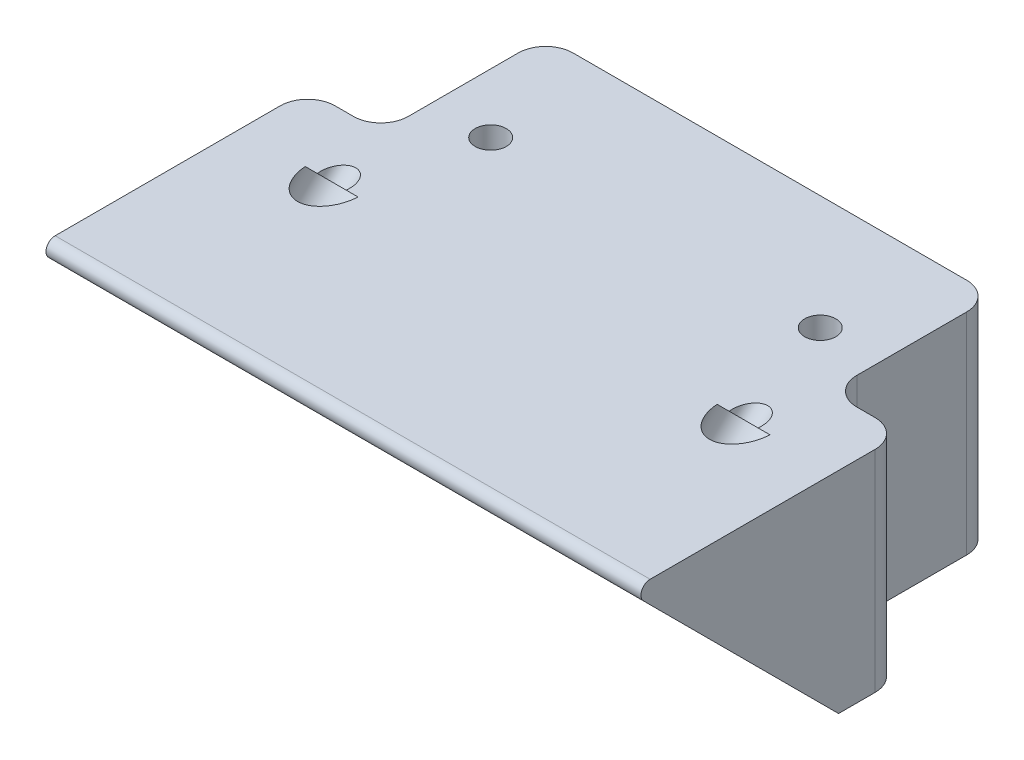
ISO-10303-21;
HEADER;
FILE_DESCRIPTION(('STEP AP214'),'2;1');
FILE_NAME('part.step','',(''),(''),'','','');
FILE_SCHEMA(('AUTOMOTIVE_DESIGN { 1 0 10303 214 1 1 1 1 }'));
ENDSEC;
DATA;
#1=APPLICATION_CONTEXT('core data for automotive mechanical design processes');
#2=APPLICATION_PROTOCOL_DEFINITION('international standard','automotive_design',2000,#1);
#3=PRODUCT_CONTEXT('',#1,'mechanical');
#4=PRODUCT('Part','Part','',(#3));
#5=PRODUCT_RELATED_PRODUCT_CATEGORY('part','',(#4));
#6=PRODUCT_DEFINITION_FORMATION('','',#4);
#7=PRODUCT_DEFINITION_CONTEXT('part definition',#1,'design');
#8=PRODUCT_DEFINITION('design','',#6,#7);
#9=PRODUCT_DEFINITION_SHAPE('','',#8);
#10=(LENGTH_UNIT() NAMED_UNIT(*) SI_UNIT(.MILLI.,.METRE.));
#11=(NAMED_UNIT(*) PLANE_ANGLE_UNIT() SI_UNIT($,.RADIAN.));
#12=(NAMED_UNIT(*) SI_UNIT($,.STERADIAN.) SOLID_ANGLE_UNIT());
#13=UNCERTAINTY_MEASURE_WITH_UNIT(LENGTH_MEASURE(1.E-05),#10,'distance_accuracy_value','');
#14=(GEOMETRIC_REPRESENTATION_CONTEXT(3) GLOBAL_UNCERTAINTY_ASSIGNED_CONTEXT((#13)) GLOBAL_UNIT_ASSIGNED_CONTEXT((#10,
#11,#12)) REPRESENTATION_CONTEXT('',''));
#15=CARTESIAN_POINT('',(0.,0.,0.));
#16=DIRECTION('',(0.,0.,1.));
#17=DIRECTION('',(1.,0.,0.));
#18=AXIS2_PLACEMENT_3D('',#15,#16,#17);
#19=CARTESIAN_POINT('',(0.,23.,0.));
#20=DIRECTION('',(0.,-1.,0.));
#21=DIRECTION('',(0.,0.,-1.));
#22=AXIS2_PLACEMENT_3D('',#19,#20,#21);
#23=PLANE('',#22);
#24=CARTESIAN_POINT('',(-18.,23.,0.));
#25=DIRECTION('',(0.,-1.,0.));
#26=DIRECTION('',(0.,0.,-1.));
#27=AXIS2_PLACEMENT_3D('',#24,#25,#26);
#28=CIRCLE('',#27,1.7);
#29=CARTESIAN_POINT('',(-18.,23.,-1.7));
#30=VERTEX_POINT('',#29);
#31=EDGE_CURVE('E345',#30,#30,#28,.T.);
#32=ORIENTED_EDGE('',*,*,#31,.T.);
#33=EDGE_LOOP('',(#32));
#34=FACE_BOUND('',#33,.T.);
#35=CARTESIAN_POINT('',(18.,23.,0.));
#36=DIRECTION('',(0.,-1.,0.));
#37=DIRECTION('',(0.,0.,1.));
#38=AXIS2_PLACEMENT_3D('',#35,#36,#37);
#39=CIRCLE('',#38,1.7);
#40=CARTESIAN_POINT('',(18.,23.,1.7));
#41=VERTEX_POINT('',#40);
#42=EDGE_CURVE('E506',#41,#41,#39,.T.);
#43=ORIENTED_EDGE('',*,*,#42,.T.);
#44=EDGE_LOOP('',(#43));
#45=FACE_BOUND('',#44,.T.);
#46=DIRECTION('',(1.,0.,0.));
#47=VECTOR('',#46,1.);
#48=CARTESIAN_POINT('',(-32.5,23.,5.5));
#49=LINE('',#48,#47);
#50=CARTESIAN_POINT('',(-29.5,23.,5.5));
#51=VERTEX_POINT('',#50);
#52=CARTESIAN_POINT('',(-27.5,23.,5.5));
#53=VERTEX_POINT('',#52);
#54=EDGE_CURVE('E464',#51,#53,#49,.T.);
#55=ORIENTED_EDGE('',*,*,#54,.F.);
#56=CARTESIAN_POINT('',(-29.5,23.,8.5));
#57=DIRECTION('',(0.,-1.,0.));
#58=DIRECTION('',(0.,0.,-1.));
#59=AXIS2_PLACEMENT_3D('',#56,#57,#58);
#60=CIRCLE('',#59,3.);
#61=CARTESIAN_POINT('',(-32.5,23.,8.5));
#62=VERTEX_POINT('',#61);
#63=EDGE_CURVE('E393',#51,#62,#60,.F.);
#64=ORIENTED_EDGE('',*,*,#63,.T.);
#65=DIRECTION('',(0.,0.,1.));
#66=VECTOR('',#65,1.);
#67=CARTESIAN_POINT('',(-32.5,23.,12.5));
#68=LINE('',#67,#66);
#69=CARTESIAN_POINT('',(-32.5,23.,33.085786437627));
#70=VERTEX_POINT('',#69);
#71=EDGE_CURVE('E306',#62,#70,#68,.T.);
#72=ORIENTED_EDGE('',*,*,#71,.T.);
#73=DIRECTION('',(1.,0.,0.));
#74=VECTOR('',#73,1.);
#75=CARTESIAN_POINT('',(32.5,23.,33.085786437627));
#76=LINE('',#75,#74);
#77=CARTESIAN_POINT('',(32.5,23.,33.085786437627));
#78=VERTEX_POINT('',#77);
#79=EDGE_CURVE('E209',#70,#78,#76,.T.);
#80=ORIENTED_EDGE('',*,*,#79,.T.);
#81=DIRECTION('',(0.,0.,-1.));
#82=VECTOR('',#81,1.);
#83=CARTESIAN_POINT('',(32.5,23.,12.5));
#84=LINE('',#83,#82);
#85=CARTESIAN_POINT('',(32.5,23.,8.49999999999999));
#86=VERTEX_POINT('',#85);
#87=EDGE_CURVE('E297',#78,#86,#84,.T.);
#88=ORIENTED_EDGE('',*,*,#87,.T.);
#89=CARTESIAN_POINT('',(29.5,23.,8.49999999999999));
#90=DIRECTION('',(0.,-1.,0.));
#91=DIRECTION('',(0.,0.,-1.));
#92=AXIS2_PLACEMENT_3D('',#89,#90,#91);
#93=CIRCLE('',#92,3.);
#94=CARTESIAN_POINT('',(29.5,23.,5.49999999999999));
#95=VERTEX_POINT('',#94);
#96=EDGE_CURVE('E387',#86,#95,#93,.F.);
#97=ORIENTED_EDGE('',*,*,#96,.T.);
#98=DIRECTION('',(1.,0.,0.));
#99=VECTOR('',#98,1.);
#100=CARTESIAN_POINT('',(32.5,23.,5.49999999999999));
#101=LINE('',#100,#99);
#102=CARTESIAN_POINT('',(27.5,23.,5.49999999999999));
#103=VERTEX_POINT('',#102);
#104=EDGE_CURVE('E456',#103,#95,#101,.T.);
#105=ORIENTED_EDGE('',*,*,#104,.F.);
#106=CARTESIAN_POINT('',(27.5,23.,2.49999999999999));
#107=DIRECTION('',(0.,-1.,0.));
#108=DIRECTION('',(0.,0.,-1.));
#109=AXIS2_PLACEMENT_3D('',#106,#107,#108);
#110=CIRCLE('',#109,3.);
#111=CARTESIAN_POINT('',(24.5,23.,2.49999999999999));
#112=VERTEX_POINT('',#111);
#113=EDGE_CURVE('E54',#103,#112,#110,.T.);
#114=ORIENTED_EDGE('',*,*,#113,.T.);
#115=DIRECTION('',(0.,0.,1.));
#116=VECTOR('',#115,1.);
#117=CARTESIAN_POINT('',(24.5,23.,-12.5));
#118=LINE('',#117,#116);
#119=CARTESIAN_POINT('',(24.5,23.,-9.5));
#120=VERTEX_POINT('',#119);
#121=EDGE_CURVE('E454',#120,#112,#118,.T.);
#122=ORIENTED_EDGE('',*,*,#121,.F.);
#123=CARTESIAN_POINT('',(21.5,23.,-9.5));
#124=DIRECTION('',(0.,-1.,0.));
#125=DIRECTION('',(0.,0.,-1.));
#126=AXIS2_PLACEMENT_3D('',#123,#124,#125);
#127=CIRCLE('',#126,3.);
#128=CARTESIAN_POINT('',(21.5,23.,-12.5));
#129=VERTEX_POINT('',#128);
#130=EDGE_CURVE('E384',#120,#129,#127,.F.);
#131=ORIENTED_EDGE('',*,*,#130,.T.);
#132=DIRECTION('',(-1.,0.,0.));
#133=VECTOR('',#132,1.);
#134=CARTESIAN_POINT('',(-32.5,23.,-12.5));
#135=LINE('',#134,#133);
#136=CARTESIAN_POINT('',(-21.5,23.,-12.5));
#137=VERTEX_POINT('',#136);
#138=EDGE_CURVE('E301',#129,#137,#135,.T.);
#139=ORIENTED_EDGE('',*,*,#138,.T.);
#140=CARTESIAN_POINT('',(-21.5,23.,-9.5));
#141=DIRECTION('',(0.,-1.,0.));
#142=DIRECTION('',(0.,0.,-1.));
#143=AXIS2_PLACEMENT_3D('',#140,#141,#142);
#144=CIRCLE('',#143,3.);
#145=CARTESIAN_POINT('',(-24.5,23.,-9.5));
#146=VERTEX_POINT('',#145);
#147=EDGE_CURVE('E390',#137,#146,#144,.F.);
#148=ORIENTED_EDGE('',*,*,#147,.T.);
#149=DIRECTION('',(0.,0.,-1.));
#150=VECTOR('',#149,1.);
#151=CARTESIAN_POINT('',(-24.5,23.,-12.5));
#152=LINE('',#151,#150);
#153=CARTESIAN_POINT('',(-24.5,23.,2.5));
#154=VERTEX_POINT('',#153);
#155=EDGE_CURVE('E502',#154,#146,#152,.T.);
#156=ORIENTED_EDGE('',*,*,#155,.F.);
#157=CARTESIAN_POINT('',(-27.5,23.,2.5));
#158=DIRECTION('',(0.,-1.,0.));
#159=DIRECTION('',(0.,0.,-1.));
#160=AXIS2_PLACEMENT_3D('',#157,#158,#159);
#161=CIRCLE('',#160,3.);
#162=EDGE_CURVE('E442',#154,#53,#161,.T.);
#163=ORIENTED_EDGE('',*,*,#162,.T.);
#164=EDGE_LOOP('',(#55,#64,#72,#80,#88,#97,#105,#114,#122,#131,#139,#148,#156,#163));
#165=FACE_BOUND('',#164,.T.);
#166=CARTESIAN_POINT('',(22.5,23.,12.5000000000001));
#167=DIRECTION('',(0.,-1.,0.));
#168=DIRECTION('',(0.,0.,1.));
#169=AXIS2_PLACEMENT_3D('',#166,#167,#168);
#170=ELLIPSE('',#169,4.10121933088197,2.9);
#171=CARTESIAN_POINT('',(25.3880081290223,23.,12.8725830020305));
#172=VERTEX_POINT('',#171);
#173=CARTESIAN_POINT('',(19.6119918709777,23.,12.8725830020305));
#174=VERTEX_POINT('',#173);
#175=EDGE_CURVE('E210',#172,#174,#170,.T.);
#176=ORIENTED_EDGE('',*,*,#175,.T.);
#177=DIRECTION('',(1.,0.,0.));
#178=VECTOR('',#177,1.);
#179=CARTESIAN_POINT('',(0.,23.,12.8725830020305));
#180=LINE('',#179,#178);
#181=CARTESIAN_POINT('',(20.9218393765846,23.,12.8725830020305));
#182=VERTEX_POINT('',#181);
#183=EDGE_CURVE('E239',#174,#182,#180,.T.);
#184=ORIENTED_EDGE('',*,*,#183,.T.);
#185=CARTESIAN_POINT('',(22.5,23.,12.5000000000001));
#186=DIRECTION('',(0.,-1.,0.));
#187=DIRECTION('',(0.,0.,1.));
#188=AXIS2_PLACEMENT_3D('',#185,#186,#187);
#189=ELLIPSE('',#188,2.26274169979695,1.6);
#190=CARTESIAN_POINT('',(24.0781606234154,23.,12.8725830020305));
#191=VERTEX_POINT('',#190);
#192=EDGE_CURVE('E240',#182,#191,#189,.T.);
#193=ORIENTED_EDGE('',*,*,#192,.T.);
#194=EDGE_CURVE('E230',#191,#172,#180,.T.);
#195=ORIENTED_EDGE('',*,*,#194,.T.);
#196=EDGE_LOOP('',(#176,#184,#193,#195));
#197=FACE_BOUND('',#196,.T.);
#198=DIRECTION('',(-1.,0.,0.));
#199=VECTOR('',#198,1.);
#200=CARTESIAN_POINT('',(0.,23.,12.8725830020305));
#201=LINE('',#200,#199);
#202=CARTESIAN_POINT('',(-19.6119918709777,23.,12.8725830020305));
#203=VERTEX_POINT('',#202);
#204=CARTESIAN_POINT('',(-20.9218393765846,23.,12.8725830020305));
#205=VERTEX_POINT('',#204);
#206=EDGE_CURVE('E214',#203,#205,#201,.T.);
#207=ORIENTED_EDGE('',*,*,#206,.F.);
#208=CARTESIAN_POINT('',(-22.5,23.,12.5000000000001));
#209=DIRECTION('',(0.,-1.,0.));
#210=DIRECTION('',(0.,0.,1.));
#211=AXIS2_PLACEMENT_3D('',#208,#209,#210);
#212=ELLIPSE('',#211,4.10121933088197,2.9);
#213=CARTESIAN_POINT('',(-25.3880081290223,23.,12.8725830020305));
#214=VERTEX_POINT('',#213);
#215=EDGE_CURVE('E201',#203,#214,#212,.T.);
#216=ORIENTED_EDGE('',*,*,#215,.T.);
#217=CARTESIAN_POINT('',(-24.0781606234154,23.,12.8725830020305));
#218=VERTEX_POINT('',#217);
#219=EDGE_CURVE('E216',#218,#214,#201,.T.);
#220=ORIENTED_EDGE('',*,*,#219,.F.);
#221=CARTESIAN_POINT('',(-22.5,23.,12.5000000000001));
#222=DIRECTION('',(0.,-1.,0.));
#223=DIRECTION('',(0.,0.,1.));
#224=AXIS2_PLACEMENT_3D('',#221,#222,#223);
#225=ELLIPSE('',#224,2.26274169979695,1.6);
#226=EDGE_CURVE('E223',#218,#205,#225,.T.);
#227=ORIENTED_EDGE('',*,*,#226,.T.);
#228=EDGE_LOOP('',(#207,#216,#220,#227));
#229=FACE_BOUND('',#228,.T.);
#230=ADVANCED_FACE('F45',(#34,#45,#165,#197,#229),#23,.F.);
#231=CARTESIAN_POINT('',(22.5,35.5,0.));
#232=DIRECTION('',(0.,-0.707106781186549,0.707106781186546));
#233=DIRECTION('',(0.,-0.707106781186546,-0.707106781186549));
#234=AXIS2_PLACEMENT_3D('',#231,#232,#233);
#235=CYLINDRICAL_SURFACE('',#234,1.6);
#236=CARTESIAN_POINT('',(22.5,11.5,24.));
#237=DIRECTION('',(0.,-0.707106781186549,0.707106781186546));
#238=DIRECTION('',(0.,-0.707106781186546,-0.707106781186549));
#239=AXIS2_PLACEMENT_3D('',#236,#237,#238);
#240=CIRCLE('',#239,1.6);
#241=CARTESIAN_POINT('',(22.5,10.3686291501015,22.8686291501016));
#242=VERTEX_POINT('',#241);
#243=EDGE_CURVE('E245',#242,#242,#240,.T.);
#244=ORIENTED_EDGE('',*,*,#243,.T.);
#245=EDGE_LOOP('',(#244));
#246=FACE_BOUND('',#245,.T.);
#247=CARTESIAN_POINT('',(22.5,16.4497474683058,19.0502525316942));
#248=DIRECTION('',(0.,0.707106781186549,-0.707106781186546));
#249=DIRECTION('',(0.,0.707106781186546,0.707106781186549));
#250=AXIS2_PLACEMENT_3D('',#247,#248,#249);
#251=CIRCLE('',#250,1.6);
#252=CARTESIAN_POINT('',(22.5,17.5811183182043,20.1816233815927));
#253=VERTEX_POINT('',#252);
#254=EDGE_CURVE('E225',#253,#253,#251,.F.);
#255=ORIENTED_EDGE('',*,*,#254,.F.);
#256=EDGE_LOOP('',(#255));
#257=FACE_BOUND('',#256,.T.);
#258=ADVANCED_FACE('F538',(#246,#257),#235,.F.);
#259=CARTESIAN_POINT('',(-22.5,35.5,0.));
#260=DIRECTION('',(0.,-0.707106781186549,0.707106781186546));
#261=DIRECTION('',(0.,-0.707106781186546,-0.707106781186549));
#262=AXIS2_PLACEMENT_3D('',#259,#260,#261);
#263=CYLINDRICAL_SURFACE('',#262,1.6);
#264=CARTESIAN_POINT('',(-22.5,22.8137084989848,12.6862915010153));
#265=DIRECTION('',(0.,-0.707106781186549,0.707106781186546));
#266=DIRECTION('',(0.,-0.707106781186546,-0.707106781186549));
#267=AXIS2_PLACEMENT_3D('',#264,#265,#266);
#268=CIRCLE('',#267,1.6);
#269=EDGE_CURVE('E309',#205,#218,#268,.F.);
#270=ORIENTED_EDGE('',*,*,#269,.F.);
#271=ORIENTED_EDGE('',*,*,#226,.F.);
#272=EDGE_LOOP('',(#270,#271));
#273=FACE_BOUND('',#272,.T.);
#274=ADVANCED_FACE('F545',(#273),#263,.F.);
#275=CARTESIAN_POINT('',(32.5,23.,12.5));
#276=DIRECTION('',(-1.,0.,0.));
#277=DIRECTION('',(0.,0.,1.));
#278=AXIS2_PLACEMENT_3D('',#275,#276,#277);
#279=PLANE('',#278);
#280=DIRECTION('',(0.,0.,-1.));
#281=VECTOR('',#280,1.);
#282=CARTESIAN_POINT('',(32.5,0.,12.5));
#283=LINE('',#282,#281);
#284=CARTESIAN_POINT('',(32.5,0.,12.5));
#285=VERTEX_POINT('',#284);
#286=CARTESIAN_POINT('',(32.5,0.,8.49999999999999));
#287=VERTEX_POINT('',#286);
#288=EDGE_CURVE('E294',#285,#287,#283,.T.);
#289=ORIENTED_EDGE('',*,*,#288,.T.);
#290=DIRECTION('',(0.,1.,0.));
#291=VECTOR('',#290,1.);
#292=CARTESIAN_POINT('',(32.5,23.,8.49999999999999));
#293=LINE('',#292,#291);
#294=EDGE_CURVE('E424',#287,#86,#293,.T.);
#295=ORIENTED_EDGE('',*,*,#294,.T.);
#296=ORIENTED_EDGE('',*,*,#87,.F.);
#297=CARTESIAN_POINT('',(32.5,22.,33.085786437627));
#298=DIRECTION('',(-1.,0.,0.));
#299=DIRECTION('',(0.,0.,1.));
#300=AXIS2_PLACEMENT_3D('',#297,#298,#299);
#301=CIRCLE('',#300,1.);
#302=CARTESIAN_POINT('',(32.5,21.2928932188134,33.7928932188135));
#303=VERTEX_POINT('',#302);
#304=EDGE_CURVE('E352',#78,#303,#301,.F.);
#305=ORIENTED_EDGE('',*,*,#304,.T.);
#306=DIRECTION('',(0.,-0.707106781186546,-0.707106781186549));
#307=VECTOR('',#306,1.);
#308=CARTESIAN_POINT('',(32.5,0.,12.5));
#309=LINE('',#308,#307);
#310=EDGE_CURVE('E279',#303,#285,#309,.T.);
#311=ORIENTED_EDGE('',*,*,#310,.T.);
#312=EDGE_LOOP('',(#289,#295,#296,#305,#311));
#313=FACE_BOUND('',#312,.T.);
#314=ADVANCED_FACE('F477',(#313),#279,.F.);
#315=CARTESIAN_POINT('',(-32.5,23.,-12.5));
#316=DIRECTION('',(0.,0.,1.));
#317=DIRECTION('',(1.,0.,0.));
#318=AXIS2_PLACEMENT_3D('',#315,#316,#317);
#319=PLANE('',#318);
#320=DIRECTION('',(-1.,0.,0.));
#321=VECTOR('',#320,1.);
#322=CARTESIAN_POINT('',(-32.5,0.,-12.5));
#323=LINE('',#322,#321);
#324=CARTESIAN_POINT('',(-12.5,0.,-12.5));
#325=VERTEX_POINT('',#324);
#326=CARTESIAN_POINT('',(-21.5,0.,-12.5));
#327=VERTEX_POINT('',#326);
#328=EDGE_CURVE('E312',#325,#327,#323,.T.);
#329=ORIENTED_EDGE('',*,*,#328,.T.);
#330=DIRECTION('',(0.,1.,0.));
#331=VECTOR('',#330,1.);
#332=CARTESIAN_POINT('',(-21.5,23.,-12.5));
#333=LINE('',#332,#331);
#334=EDGE_CURVE('E413',#327,#137,#333,.T.);
#335=ORIENTED_EDGE('',*,*,#334,.T.);
#336=ORIENTED_EDGE('',*,*,#138,.F.);
#337=DIRECTION('',(0.,1.,0.));
#338=VECTOR('',#337,1.);
#339=CARTESIAN_POINT('',(21.5,23.,-12.5));
#340=LINE('',#339,#338);
#341=CARTESIAN_POINT('',(21.5,0.,-12.5));
#342=VERTEX_POINT('',#341);
#343=EDGE_CURVE('E410',#129,#342,#340,.F.);
#344=ORIENTED_EDGE('',*,*,#343,.T.);
#345=CARTESIAN_POINT('',(12.5,0.,-12.5));
#346=VERTEX_POINT('',#345);
#347=EDGE_CURVE('E313',#342,#346,#323,.T.);
#348=ORIENTED_EDGE('',*,*,#347,.T.);
#349=DIRECTION('',(0.,-1.,0.));
#350=VECTOR('',#349,1.);
#351=CARTESIAN_POINT('',(12.5,18.,-12.5));
#352=LINE('',#351,#350);
#353=CARTESIAN_POINT('',(12.5,18.,-12.5));
#354=VERTEX_POINT('',#353);
#355=EDGE_CURVE('E283',#354,#346,#352,.T.);
#356=ORIENTED_EDGE('',*,*,#355,.F.);
#357=DIRECTION('',(1.,0.,0.));
#358=VECTOR('',#357,1.);
#359=CARTESIAN_POINT('',(-12.5,18.,-12.5));
#360=LINE('',#359,#358);
#361=CARTESIAN_POINT('',(-12.5,18.,-12.5));
#362=VERTEX_POINT('',#361);
#363=EDGE_CURVE('E253',#362,#354,#360,.T.);
#364=ORIENTED_EDGE('',*,*,#363,.F.);
#365=DIRECTION('',(0.,-1.,0.));
#366=VECTOR('',#365,1.);
#367=CARTESIAN_POINT('',(-12.5,18.,-12.5));
#368=LINE('',#367,#366);
#369=EDGE_CURVE('E266',#362,#325,#368,.T.);
#370=ORIENTED_EDGE('',*,*,#369,.T.);
#371=EDGE_LOOP('',(#329,#335,#336,#344,#348,#356,#364,#370));
#372=FACE_BOUND('',#371,.T.);
#373=ADVANCED_FACE('F568',(#372),#319,.F.);
#374=CARTESIAN_POINT('',(-32.5,23.,12.5));
#375=DIRECTION('',(1.,0.,0.));
#376=DIRECTION('',(0.,0.,-1.));
#377=AXIS2_PLACEMENT_3D('',#374,#375,#376);
#378=PLANE('',#377);
#379=ORIENTED_EDGE('',*,*,#71,.F.);
#380=DIRECTION('',(0.,1.,0.));
#381=VECTOR('',#380,1.);
#382=CARTESIAN_POINT('',(-32.5,23.,8.5));
#383=LINE('',#382,#381);
#384=CARTESIAN_POINT('',(-32.5,0.,8.5));
#385=VERTEX_POINT('',#384);
#386=EDGE_CURVE('E396',#62,#385,#383,.F.);
#387=ORIENTED_EDGE('',*,*,#386,.T.);
#388=DIRECTION('',(0.,0.,1.));
#389=VECTOR('',#388,1.);
#390=CARTESIAN_POINT('',(-32.5,0.,12.5));
#391=LINE('',#390,#389);
#392=CARTESIAN_POINT('',(-32.5,0.,12.5));
#393=VERTEX_POINT('',#392);
#394=EDGE_CURVE('E316',#385,#393,#391,.T.);
#395=ORIENTED_EDGE('',*,*,#394,.T.);
#396=DIRECTION('',(0.,0.707106781186546,0.707106781186549));
#397=VECTOR('',#396,1.);
#398=CARTESIAN_POINT('',(-32.5,0.,12.5));
#399=LINE('',#398,#397);
#400=CARTESIAN_POINT('',(-32.5,21.2928932188134,33.7928932188135));
#401=VERTEX_POINT('',#400);
#402=EDGE_CURVE('E290',#393,#401,#399,.T.);
#403=ORIENTED_EDGE('',*,*,#402,.T.);
#404=CARTESIAN_POINT('',(-32.5,22.,33.085786437627));
#405=DIRECTION('',(1.,0.,0.));
#406=DIRECTION('',(0.,0.,-1.));
#407=AXIS2_PLACEMENT_3D('',#404,#405,#406);
#408=CIRCLE('',#407,1.);
#409=EDGE_CURVE('E358',#401,#70,#408,.F.);
#410=ORIENTED_EDGE('',*,*,#409,.T.);
#411=EDGE_LOOP('',(#379,#387,#395,#403,#410));
#412=FACE_BOUND('',#411,.T.);
#413=ADVANCED_FACE('F565',(#412),#378,.F.);
#414=CARTESIAN_POINT('',(0.,0.,0.));
#415=DIRECTION('',(0.,-1.,0.));
#416=DIRECTION('',(0.,0.,-1.));
#417=AXIS2_PLACEMENT_3D('',#414,#415,#416);
#418=PLANE('',#417);
#419=ORIENTED_EDGE('',*,*,#394,.F.);
#420=CARTESIAN_POINT('',(-29.5,0.,8.5));
#421=DIRECTION('',(0.,-1.,0.));
#422=DIRECTION('',(0.,0.,-1.));
#423=AXIS2_PLACEMENT_3D('',#420,#421,#422);
#424=CIRCLE('',#423,3.);
#425=CARTESIAN_POINT('',(-29.5,0.,5.5));
#426=VERTEX_POINT('',#425);
#427=EDGE_CURVE('E407',#385,#426,#424,.T.);
#428=ORIENTED_EDGE('',*,*,#427,.T.);
#429=DIRECTION('',(-1.,0.,0.));
#430=VECTOR('',#429,1.);
#431=CARTESIAN_POINT('',(0.,0.,5.5));
#432=LINE('',#431,#430);
#433=CARTESIAN_POINT('',(-27.5,0.,5.5));
#434=VERTEX_POINT('',#433);
#435=EDGE_CURVE('E369',#434,#426,#432,.T.);
#436=ORIENTED_EDGE('',*,*,#435,.F.);
#437=CARTESIAN_POINT('',(-27.5,0.,2.5));
#438=DIRECTION('',(0.,-1.,0.));
#439=DIRECTION('',(0.,0.,-1.));
#440=AXIS2_PLACEMENT_3D('',#437,#438,#439);
#441=CIRCLE('',#440,3.);
#442=CARTESIAN_POINT('',(-24.5,0.,2.5));
#443=VERTEX_POINT('',#442);
#444=EDGE_CURVE('E445',#434,#443,#441,.F.);
#445=ORIENTED_EDGE('',*,*,#444,.T.);
#446=DIRECTION('',(0.,0.,1.));
#447=VECTOR('',#446,1.);
#448=CARTESIAN_POINT('',(-24.5,0.,0.));
#449=LINE('',#448,#447);
#450=CARTESIAN_POINT('',(-24.5,0.,-9.5));
#451=VERTEX_POINT('',#450);
#452=EDGE_CURVE('E373',#451,#443,#449,.T.);
#453=ORIENTED_EDGE('',*,*,#452,.F.);
#454=CARTESIAN_POINT('',(-21.5,0.,-9.5));
#455=DIRECTION('',(0.,-1.,0.));
#456=DIRECTION('',(0.,0.,-1.));
#457=AXIS2_PLACEMENT_3D('',#454,#455,#456);
#458=CIRCLE('',#457,3.);
#459=EDGE_CURVE('E404',#451,#327,#458,.T.);
#460=ORIENTED_EDGE('',*,*,#459,.T.);
#461=ORIENTED_EDGE('',*,*,#328,.F.);
#462=DIRECTION('',(0.,0.,-1.));
#463=VECTOR('',#462,1.);
#464=CARTESIAN_POINT('',(-12.5,0.,-12.5));
#465=LINE('',#464,#463);
#466=CARTESIAN_POINT('',(-12.5,0.,7.5));
#467=VERTEX_POINT('',#466);
#468=EDGE_CURVE('E248',#467,#325,#465,.T.);
#469=ORIENTED_EDGE('',*,*,#468,.F.);
#470=DIRECTION('',(-1.,0.,0.));
#471=VECTOR('',#470,1.);
#472=CARTESIAN_POINT('',(-12.5,0.,7.5));
#473=LINE('',#472,#471);
#474=CARTESIAN_POINT('',(12.5,0.,7.5));
#475=VERTEX_POINT('',#474);
#476=EDGE_CURVE('E254',#475,#467,#473,.T.);
#477=ORIENTED_EDGE('',*,*,#476,.F.);
#478=DIRECTION('',(0.,0.,1.));
#479=VECTOR('',#478,1.);
#480=CARTESIAN_POINT('',(12.5,0.,-12.5));
#481=LINE('',#480,#479);
#482=EDGE_CURVE('E269',#346,#475,#481,.T.);
#483=ORIENTED_EDGE('',*,*,#482,.F.);
#484=ORIENTED_EDGE('',*,*,#347,.F.);
#485=CARTESIAN_POINT('',(21.5,0.,-9.5));
#486=DIRECTION('',(0.,-1.,0.));
#487=DIRECTION('',(0.,0.,-1.));
#488=AXIS2_PLACEMENT_3D('',#485,#486,#487);
#489=CIRCLE('',#488,3.);
#490=CARTESIAN_POINT('',(24.5,0.,-9.5));
#491=VERTEX_POINT('',#490);
#492=EDGE_CURVE('E399',#342,#491,#489,.T.);
#493=ORIENTED_EDGE('',*,*,#492,.T.);
#494=DIRECTION('',(0.,0.,-1.));
#495=VECTOR('',#494,1.);
#496=CARTESIAN_POINT('',(24.5,0.,0.));
#497=LINE('',#496,#495);
#498=CARTESIAN_POINT('',(24.5,0.,2.49999999999999));
#499=VERTEX_POINT('',#498);
#500=EDGE_CURVE('E362',#499,#491,#497,.T.);
#501=ORIENTED_EDGE('',*,*,#500,.F.);
#502=CARTESIAN_POINT('',(27.5,0.,2.49999999999999));
#503=DIRECTION('',(0.,-1.,0.));
#504=DIRECTION('',(0.,0.,-1.));
#505=AXIS2_PLACEMENT_3D('',#502,#503,#504);
#506=CIRCLE('',#505,3.);
#507=CARTESIAN_POINT('',(27.5,0.,5.49999999999999));
#508=VERTEX_POINT('',#507);
#509=EDGE_CURVE('E11',#499,#508,#506,.F.);
#510=ORIENTED_EDGE('',*,*,#509,.T.);
#511=DIRECTION('',(-1.,0.,0.));
#512=VECTOR('',#511,1.);
#513=CARTESIAN_POINT('',(0.,0.,5.5));
#514=LINE('',#513,#512);
#515=CARTESIAN_POINT('',(29.5,0.,5.49999999999999));
#516=VERTEX_POINT('',#515);
#517=EDGE_CURVE('E366',#516,#508,#514,.T.);
#518=ORIENTED_EDGE('',*,*,#517,.F.);
#519=CARTESIAN_POINT('',(29.5,0.,8.49999999999999));
#520=DIRECTION('',(0.,-1.,0.));
#521=DIRECTION('',(0.,0.,-1.));
#522=AXIS2_PLACEMENT_3D('',#519,#520,#521);
#523=CIRCLE('',#522,3.);
#524=EDGE_CURVE('E61',#516,#287,#523,.T.);
#525=ORIENTED_EDGE('',*,*,#524,.T.);
#526=ORIENTED_EDGE('',*,*,#288,.F.);
#527=DIRECTION('',(1.,0.,0.));
#528=VECTOR('',#527,1.);
#529=CARTESIAN_POINT('',(-32.5,0.,12.5));
#530=LINE('',#529,#528);
#531=EDGE_CURVE('E302',#393,#285,#530,.T.);
#532=ORIENTED_EDGE('',*,*,#531,.F.);
#533=EDGE_LOOP('',(#419,#428,#436,#445,#453,#460,#461,#469,#477,#483,#484,#493,#501,#510,#518,
#525,#526,#532));
#534=FACE_BOUND('',#533,.T.);
#535=CARTESIAN_POINT('',(-18.,0.,0.));
#536=DIRECTION('',(0.,-1.,0.));
#537=DIRECTION('',(0.,0.,-1.));
#538=AXIS2_PLACEMENT_3D('',#535,#536,#537);
#539=CIRCLE('',#538,1.7);
#540=CARTESIAN_POINT('',(-18.,0.,-1.7));
#541=VERTEX_POINT('',#540);
#542=EDGE_CURVE('E344',#541,#541,#539,.T.);
#543=ORIENTED_EDGE('',*,*,#542,.F.);
#544=EDGE_LOOP('',(#543));
#545=FACE_BOUND('',#544,.T.);
#546=CARTESIAN_POINT('',(18.,0.,0.));
#547=DIRECTION('',(0.,-1.,0.));
#548=DIRECTION('',(0.,0.,-1.));
#549=AXIS2_PLACEMENT_3D('',#546,#547,#548);
#550=CIRCLE('',#549,1.7);
#551=CARTESIAN_POINT('',(18.,0.,-1.7));
#552=VERTEX_POINT('',#551);
#553=EDGE_CURVE('E340',#552,#552,#550,.T.);
#554=ORIENTED_EDGE('',*,*,#553,.F.);
#555=EDGE_LOOP('',(#554));
#556=FACE_BOUND('',#555,.T.);
#557=ADVANCED_FACE('F470',(#534,#545,#556),#418,.T.);
#558=CARTESIAN_POINT('',(-65.0269119345812,0.,12.5));
#559=DIRECTION('',(0.,-0.707106781186549,0.707106781186546));
#560=DIRECTION('',(0.,-0.707106781186546,-0.707106781186549));
#561=AXIS2_PLACEMENT_3D('',#558,#559,#560);
#562=PLANE('',#561);
#563=CARTESIAN_POINT('',(-22.5,11.5,24.));
#564=DIRECTION('',(0.,-0.707106781186549,0.707106781186546));
#565=DIRECTION('',(0.,-0.707106781186546,-0.707106781186549));
#566=AXIS2_PLACEMENT_3D('',#563,#564,#565);
#567=CIRCLE('',#566,1.6);
#568=CARTESIAN_POINT('',(-22.5,10.3686291501015,22.8686291501016));
#569=VERTEX_POINT('',#568);
#570=EDGE_CURVE('E244',#569,#569,#567,.T.);
#571=ORIENTED_EDGE('',*,*,#570,.F.);
#572=EDGE_LOOP('',(#571));
#573=FACE_BOUND('',#572,.T.);
#574=ORIENTED_EDGE('',*,*,#243,.F.);
#575=EDGE_LOOP('',(#574));
#576=FACE_BOUND('',#575,.T.);
#577=ORIENTED_EDGE('',*,*,#310,.F.);
#578=DIRECTION('',(1.,0.,0.));
#579=VECTOR('',#578,1.);
#580=CARTESIAN_POINT('',(-32.5,21.2928932188134,33.7928932188135));
#581=LINE('',#580,#579);
#582=EDGE_CURVE('E355',#303,#401,#581,.F.);
#583=ORIENTED_EDGE('',*,*,#582,.T.);
#584=ORIENTED_EDGE('',*,*,#402,.F.);
#585=ORIENTED_EDGE('',*,*,#531,.T.);
#586=EDGE_LOOP('',(#577,#583,#584,#585));
#587=FACE_BOUND('',#586,.T.);
#588=ADVANCED_FACE('F486',(#573,#576,#587),#562,.T.);
#589=CARTESIAN_POINT('',(-12.5,18.,-12.5));
#590=DIRECTION('',(-1.,0.,0.));
#591=DIRECTION('',(0.,0.,1.));
#592=AXIS2_PLACEMENT_3D('',#589,#590,#591);
#593=PLANE('',#592);
#594=ORIENTED_EDGE('',*,*,#468,.T.);
#595=ORIENTED_EDGE('',*,*,#369,.F.);
#596=DIRECTION('',(0.,0.,-1.));
#597=VECTOR('',#596,1.);
#598=CARTESIAN_POINT('',(-12.5,18.,-12.5));
#599=LINE('',#598,#597);
#600=CARTESIAN_POINT('',(-12.5,18.,7.5));
#601=VERTEX_POINT('',#600);
#602=EDGE_CURVE('E249',#601,#362,#599,.T.);
#603=ORIENTED_EDGE('',*,*,#602,.F.);
#604=DIRECTION('',(0.,-1.,0.));
#605=VECTOR('',#604,1.);
#606=CARTESIAN_POINT('',(-12.5,18.,7.5));
#607=LINE('',#606,#605);
#608=EDGE_CURVE('E276',#601,#467,#607,.T.);
#609=ORIENTED_EDGE('',*,*,#608,.T.);
#610=EDGE_LOOP('',(#594,#595,#603,#609));
#611=FACE_BOUND('',#610,.T.);
#612=ADVANCED_FACE('F678',(#611),#593,.F.);
#613=CARTESIAN_POINT('',(-12.5,18.,7.5));
#614=DIRECTION('',(0.,0.,1.));
#615=DIRECTION('',(1.,0.,0.));
#616=AXIS2_PLACEMENT_3D('',#613,#614,#615);
#617=PLANE('',#616);
#618=ORIENTED_EDGE('',*,*,#476,.T.);
#619=ORIENTED_EDGE('',*,*,#608,.F.);
#620=DIRECTION('',(-1.,0.,0.));
#621=VECTOR('',#620,1.);
#622=CARTESIAN_POINT('',(-12.5,18.,7.5));
#623=LINE('',#622,#621);
#624=CARTESIAN_POINT('',(12.5,18.,7.5));
#625=VERTEX_POINT('',#624);
#626=EDGE_CURVE('E262',#625,#601,#623,.T.);
#627=ORIENTED_EDGE('',*,*,#626,.F.);
#628=DIRECTION('',(0.,-1.,0.));
#629=VECTOR('',#628,1.);
#630=CARTESIAN_POINT('',(12.5,18.,7.5));
#631=LINE('',#630,#629);
#632=EDGE_CURVE('E280',#625,#475,#631,.T.);
#633=ORIENTED_EDGE('',*,*,#632,.T.);
#634=EDGE_LOOP('',(#618,#619,#627,#633));
#635=FACE_BOUND('',#634,.T.);
#636=ADVANCED_FACE('F780',(#635),#617,.F.);
#637=CARTESIAN_POINT('',(12.5,18.,-12.5));
#638=DIRECTION('',(1.,0.,0.));
#639=DIRECTION('',(0.,0.,-1.));
#640=AXIS2_PLACEMENT_3D('',#637,#638,#639);
#641=PLANE('',#640);
#642=ORIENTED_EDGE('',*,*,#482,.T.);
#643=ORIENTED_EDGE('',*,*,#632,.F.);
#644=DIRECTION('',(0.,0.,1.));
#645=VECTOR('',#644,1.);
#646=CARTESIAN_POINT('',(12.5,18.,-12.5));
#647=LINE('',#646,#645);
#648=EDGE_CURVE('E258',#354,#625,#647,.T.);
#649=ORIENTED_EDGE('',*,*,#648,.F.);
#650=ORIENTED_EDGE('',*,*,#355,.T.);
#651=EDGE_LOOP('',(#642,#643,#649,#650));
#652=FACE_BOUND('',#651,.T.);
#653=ADVANCED_FACE('F547',(#652),#641,.F.);
#654=CARTESIAN_POINT('',(0.,18.,0.));
#655=DIRECTION('',(0.,1.,0.));
#656=DIRECTION('',(0.,0.,1.));
#657=AXIS2_PLACEMENT_3D('',#654,#655,#656);
#658=PLANE('',#657);
#659=ORIENTED_EDGE('',*,*,#602,.T.);
#660=ORIENTED_EDGE('',*,*,#363,.T.);
#661=ORIENTED_EDGE('',*,*,#648,.T.);
#662=ORIENTED_EDGE('',*,*,#626,.T.);
#663=EDGE_LOOP('',(#659,#660,#661,#662));
#664=FACE_BOUND('',#663,.T.);
#665=ADVANCED_FACE('F536',(#664),#658,.F.);
#666=ORIENTED_EDGE('',*,*,#192,.F.);
#667=CARTESIAN_POINT('',(22.5,22.8137084989848,12.6862915010153));
#668=DIRECTION('',(0.,0.707106781186549,-0.707106781186546));
#669=DIRECTION('',(0.,0.707106781186546,0.707106781186549));
#670=AXIS2_PLACEMENT_3D('',#667,#668,#669);
#671=CIRCLE('',#670,1.6);
#672=EDGE_CURVE('E332',#182,#191,#671,.F.);
#673=ORIENTED_EDGE('',*,*,#672,.T.);
#674=EDGE_LOOP('',(#666,#673));
#675=FACE_BOUND('',#674,.T.);
#676=ADVANCED_FACE('F533',(#675),#235,.F.);
#677=CARTESIAN_POINT('',(-22.5,16.4497474683058,19.0502525316942));
#678=DIRECTION('',(0.,-0.707106781186549,0.707106781186546));
#679=DIRECTION('',(0.,-0.707106781186546,-0.707106781186549));
#680=AXIS2_PLACEMENT_3D('',#677,#678,#679);
#681=CIRCLE('',#680,1.6);
#682=CARTESIAN_POINT('',(-22.5,15.3183766184074,17.9188816817957));
#683=VERTEX_POINT('',#682);
#684=EDGE_CURVE('E218',#683,#683,#681,.F.);
#685=ORIENTED_EDGE('',*,*,#684,.T.);
#686=EDGE_LOOP('',(#685));
#687=FACE_BOUND('',#686,.T.);
#688=ORIENTED_EDGE('',*,*,#570,.T.);
#689=EDGE_LOOP('',(#688));
#690=FACE_BOUND('',#689,.T.);
#691=ADVANCED_FACE('F535',(#687,#690),#263,.F.);
#692=CARTESIAN_POINT('',(-22.5,22.8137084989848,12.6862915010153));
#693=DIRECTION('',(0.,-0.707106781186549,0.707106781186546));
#694=DIRECTION('',(0.,-0.707106781186546,-0.707106781186549));
#695=AXIS2_PLACEMENT_3D('',#692,#693,#694);
#696=CYLINDRICAL_SURFACE('',#695,2.9);
#697=CARTESIAN_POINT('',(-22.5,16.4497474683058,19.0502525316942));
#698=DIRECTION('',(0.,-0.707106781186549,0.707106781186546));
#699=DIRECTION('',(0.,-0.707106781186546,-0.707106781186549));
#700=AXIS2_PLACEMENT_3D('',#697,#698,#699);
#701=CIRCLE('',#700,2.9);
#702=CARTESIAN_POINT('',(-22.5,14.3991378028649,16.9996428662532));
#703=VERTEX_POINT('',#702);
#704=EDGE_CURVE('E219',#703,#703,#701,.T.);
#705=ORIENTED_EDGE('',*,*,#704,.T.);
#706=EDGE_LOOP('',(#705));
#707=FACE_BOUND('',#706,.T.);
#708=CARTESIAN_POINT('',(-22.5,22.8137084989848,12.6862915010153));
#709=DIRECTION('',(0.,-0.707106781186549,0.707106781186546));
#710=DIRECTION('',(0.,-0.707106781186546,-0.707106781186549));
#711=AXIS2_PLACEMENT_3D('',#708,#709,#710);
#712=CIRCLE('',#711,2.9);
#713=EDGE_CURVE('E204',#214,#203,#712,.T.);
#714=ORIENTED_EDGE('',*,*,#713,.F.);
#715=ORIENTED_EDGE('',*,*,#215,.F.);
#716=EDGE_LOOP('',(#714,#715));
#717=FACE_BOUND('',#716,.T.);
#718=ADVANCED_FACE('F203',(#707,#717),#696,.F.);
#719=CARTESIAN_POINT('',(-22.5,22.8137084989848,12.6862915010153));
#720=DIRECTION('',(0.,-0.707106781186549,0.707106781186546));
#721=DIRECTION('',(0.,-0.707106781186546,-0.707106781186549));
#722=AXIS2_PLACEMENT_3D('',#719,#720,#721);
#723=PLANE('',#722);
#724=ORIENTED_EDGE('',*,*,#206,.T.);
#725=ORIENTED_EDGE('',*,*,#269,.T.);
#726=ORIENTED_EDGE('',*,*,#219,.T.);
#727=ORIENTED_EDGE('',*,*,#713,.T.);
#728=EDGE_LOOP('',(#724,#725,#726,#727));
#729=FACE_BOUND('',#728,.T.);
#730=ADVANCED_FACE('F213',(#729),#723,.T.);
#731=CARTESIAN_POINT('',(-22.5,16.4497474683058,19.0502525316942));
#732=DIRECTION('',(0.,-0.707106781186549,0.707106781186546));
#733=DIRECTION('',(0.,-0.707106781186546,-0.707106781186549));
#734=AXIS2_PLACEMENT_3D('',#731,#732,#733);
#735=PLANE('',#734);
#736=ORIENTED_EDGE('',*,*,#704,.F.);
#737=EDGE_LOOP('',(#736));
#738=FACE_BOUND('',#737,.T.);
#739=ORIENTED_EDGE('',*,*,#684,.F.);
#740=EDGE_LOOP('',(#739));
#741=FACE_BOUND('',#740,.T.);
#742=ADVANCED_FACE('F638',(#738,#741),#735,.F.);
#743=CARTESIAN_POINT('',(22.5,22.8137084989848,12.6862915010153));
#744=DIRECTION('',(0.,-0.707106781186549,0.707106781186546));
#745=DIRECTION('',(0.,-0.707106781186546,-0.707106781186549));
#746=AXIS2_PLACEMENT_3D('',#743,#744,#745);
#747=CYLINDRICAL_SURFACE('',#746,2.9);
#748=CARTESIAN_POINT('',(22.5,16.4497474683058,19.0502525316942));
#749=DIRECTION('',(0.,-0.707106781186549,0.707106781186546));
#750=DIRECTION('',(0.,0.707106781186546,0.707106781186549));
#751=AXIS2_PLACEMENT_3D('',#748,#749,#750);
#752=CIRCLE('',#751,2.9);
#753=CARTESIAN_POINT('',(22.5,18.5003571337468,21.1008621971352));
#754=VERTEX_POINT('',#753);
#755=EDGE_CURVE('E519',#754,#754,#752,.T.);
#756=ORIENTED_EDGE('',*,*,#755,.T.);
#757=EDGE_LOOP('',(#756));
#758=FACE_BOUND('',#757,.T.);
#759=CARTESIAN_POINT('',(22.5,22.8137084989848,12.6862915010153));
#760=DIRECTION('',(0.,-0.707106781186549,0.707106781186546));
#761=DIRECTION('',(0.,0.707106781186546,0.707106781186549));
#762=AXIS2_PLACEMENT_3D('',#759,#760,#761);
#763=CIRCLE('',#762,2.9);
#764=EDGE_CURVE('E234',#174,#172,#763,.T.);
#765=ORIENTED_EDGE('',*,*,#764,.F.);
#766=ORIENTED_EDGE('',*,*,#175,.F.);
#767=EDGE_LOOP('',(#765,#766));
#768=FACE_BOUND('',#767,.T.);
#769=ADVANCED_FACE('F641',(#758,#768),#747,.F.);
#770=CARTESIAN_POINT('',(22.5,22.8137084989848,12.6862915010153));
#771=DIRECTION('',(0.,0.707106781186549,-0.707106781186546));
#772=DIRECTION('',(0.,0.707106781186546,0.707106781186549));
#773=AXIS2_PLACEMENT_3D('',#770,#771,#772);
#774=PLANE('',#773);
#775=ORIENTED_EDGE('',*,*,#764,.T.);
#776=ORIENTED_EDGE('',*,*,#194,.F.);
#777=ORIENTED_EDGE('',*,*,#672,.F.);
#778=ORIENTED_EDGE('',*,*,#183,.F.);
#779=EDGE_LOOP('',(#775,#776,#777,#778));
#780=FACE_BOUND('',#779,.T.);
#781=ADVANCED_FACE('F528',(#780),#774,.F.);
#782=CARTESIAN_POINT('',(22.5,16.4497474683058,19.0502525316942));
#783=DIRECTION('',(0.,0.707106781186549,-0.707106781186546));
#784=DIRECTION('',(0.,0.707106781186546,0.707106781186549));
#785=AXIS2_PLACEMENT_3D('',#782,#783,#784);
#786=PLANE('',#785);
#787=ORIENTED_EDGE('',*,*,#755,.F.);
#788=EDGE_LOOP('',(#787));
#789=FACE_BOUND('',#788,.T.);
#790=ORIENTED_EDGE('',*,*,#254,.T.);
#791=EDGE_LOOP('',(#790));
#792=FACE_BOUND('',#791,.T.);
#793=ADVANCED_FACE('F634',(#789,#792),#786,.T.);
#794=CARTESIAN_POINT('',(18.,23.,0.));
#795=DIRECTION('',(0.,-1.,0.));
#796=DIRECTION('',(0.,0.,-1.));
#797=AXIS2_PLACEMENT_3D('',#794,#795,#796);
#798=CYLINDRICAL_SURFACE('',#797,1.7);
#799=ORIENTED_EDGE('',*,*,#553,.T.);
#800=EDGE_LOOP('',(#799));
#801=FACE_BOUND('',#800,.T.);
#802=ORIENTED_EDGE('',*,*,#42,.F.);
#803=EDGE_LOOP('',(#802));
#804=FACE_BOUND('',#803,.T.);
#805=ADVANCED_FACE('F630',(#801,#804),#798,.F.);
#806=CARTESIAN_POINT('',(-18.,23.,0.));
#807=DIRECTION('',(0.,-1.,0.));
#808=DIRECTION('',(0.,0.,-1.));
#809=AXIS2_PLACEMENT_3D('',#806,#807,#808);
#810=CYLINDRICAL_SURFACE('',#809,1.7);
#811=ORIENTED_EDGE('',*,*,#542,.T.);
#812=EDGE_LOOP('',(#811));
#813=FACE_BOUND('',#812,.T.);
#814=ORIENTED_EDGE('',*,*,#31,.F.);
#815=EDGE_LOOP('',(#814));
#816=FACE_BOUND('',#815,.T.);
#817=ADVANCED_FACE('F574',(#813,#816),#810,.F.);
#818=CARTESIAN_POINT('',(0.,22.,33.085786437627));
#819=DIRECTION('',(-1.,0.,0.));
#820=DIRECTION('',(0.,0.,1.));
#821=AXIS2_PLACEMENT_3D('',#818,#819,#820);
#822=CYLINDRICAL_SURFACE('',#821,1.);
#823=ORIENTED_EDGE('',*,*,#409,.F.);
#824=ORIENTED_EDGE('',*,*,#582,.F.);
#825=ORIENTED_EDGE('',*,*,#304,.F.);
#826=ORIENTED_EDGE('',*,*,#79,.F.);
#827=EDGE_LOOP('',(#823,#824,#825,#826));
#828=FACE_BOUND('',#827,.T.);
#829=ADVANCED_FACE('F482',(#828),#822,.T.);
#830=CARTESIAN_POINT('',(32.5,-17.,5.49999999999999));
#831=DIRECTION('',(0.,0.,1.));
#832=DIRECTION('',(1.,0.,0.));
#833=AXIS2_PLACEMENT_3D('',#830,#831,#832);
#834=PLANE('',#833);
#835=ORIENTED_EDGE('',*,*,#104,.T.);
#836=DIRECTION('',(0.,1.,0.));
#837=VECTOR('',#836,1.);
#838=CARTESIAN_POINT('',(29.5,-17.,5.49999999999999));
#839=LINE('',#838,#837);
#840=EDGE_CURVE('E432',#95,#516,#839,.F.);
#841=ORIENTED_EDGE('',*,*,#840,.T.);
#842=ORIENTED_EDGE('',*,*,#517,.T.);
#843=DIRECTION('',(0.,1.,0.));
#844=VECTOR('',#843,1.);
#845=CARTESIAN_POINT('',(27.5,23.,5.49999999999999));
#846=LINE('',#845,#844);
#847=EDGE_CURVE('E428',#508,#103,#846,.T.);
#848=ORIENTED_EDGE('',*,*,#847,.T.);
#849=EDGE_LOOP('',(#835,#841,#842,#848));
#850=FACE_BOUND('',#849,.T.);
#851=ADVANCED_FACE('F467',(#850),#834,.F.);
#852=CARTESIAN_POINT('',(24.5,-17.,-12.5));
#853=DIRECTION('',(-1.,0.,0.));
#854=DIRECTION('',(0.,0.,1.));
#855=AXIS2_PLACEMENT_3D('',#852,#853,#854);
#856=PLANE('',#855);
#857=ORIENTED_EDGE('',*,*,#500,.T.);
#858=DIRECTION('',(0.,1.,0.));
#859=VECTOR('',#858,1.);
#860=CARTESIAN_POINT('',(24.5,-17.,-9.5));
#861=LINE('',#860,#859);
#862=EDGE_CURVE('E438',#491,#120,#861,.T.);
#863=ORIENTED_EDGE('',*,*,#862,.T.);
#864=ORIENTED_EDGE('',*,*,#121,.T.);
#865=DIRECTION('',(0.,1.,0.));
#866=VECTOR('',#865,1.);
#867=CARTESIAN_POINT('',(24.5,0.,2.49999999999999));
#868=LINE('',#867,#866);
#869=EDGE_CURVE('E435',#112,#499,#868,.F.);
#870=ORIENTED_EDGE('',*,*,#869,.T.);
#871=EDGE_LOOP('',(#857,#863,#864,#870));
#872=FACE_BOUND('',#871,.T.);
#873=ADVANCED_FACE('F461',(#872),#856,.F.);
#874=CARTESIAN_POINT('',(-24.5,-17.,-12.5));
#875=DIRECTION('',(1.,0.,0.));
#876=DIRECTION('',(0.,0.,-1.));
#877=AXIS2_PLACEMENT_3D('',#874,#875,#876);
#878=PLANE('',#877);
#879=ORIENTED_EDGE('',*,*,#155,.T.);
#880=DIRECTION('',(0.,1.,0.));
#881=VECTOR('',#880,1.);
#882=CARTESIAN_POINT('',(-24.5,-17.,-9.5));
#883=LINE('',#882,#881);
#884=EDGE_CURVE('E421',#146,#451,#883,.F.);
#885=ORIENTED_EDGE('',*,*,#884,.T.);
#886=ORIENTED_EDGE('',*,*,#452,.T.);
#887=DIRECTION('',(0.,1.,0.));
#888=VECTOR('',#887,1.);
#889=CARTESIAN_POINT('',(-24.5,23.,2.5));
#890=LINE('',#889,#888);
#891=EDGE_CURVE('E417',#443,#154,#890,.T.);
#892=ORIENTED_EDGE('',*,*,#891,.T.);
#893=EDGE_LOOP('',(#879,#885,#886,#892));
#894=FACE_BOUND('',#893,.T.);
#895=ADVANCED_FACE('F614',(#894),#878,.F.);
#896=CARTESIAN_POINT('',(-32.5,-17.,5.5));
#897=DIRECTION('',(0.,0.,1.));
#898=DIRECTION('',(1.,0.,0.));
#899=AXIS2_PLACEMENT_3D('',#896,#897,#898);
#900=PLANE('',#899);
#901=ORIENTED_EDGE('',*,*,#435,.T.);
#902=DIRECTION('',(0.,1.,0.));
#903=VECTOR('',#902,1.);
#904=CARTESIAN_POINT('',(-29.5,-17.,5.5));
#905=LINE('',#904,#903);
#906=EDGE_CURVE('E380',#426,#51,#905,.T.);
#907=ORIENTED_EDGE('',*,*,#906,.T.);
#908=ORIENTED_EDGE('',*,*,#54,.T.);
#909=DIRECTION('',(0.,1.,0.));
#910=VECTOR('',#909,1.);
#911=CARTESIAN_POINT('',(-27.5,0.,5.5));
#912=LINE('',#911,#910);
#913=EDGE_CURVE('E377',#53,#434,#912,.F.);
#914=ORIENTED_EDGE('',*,*,#913,.T.);
#915=EDGE_LOOP('',(#901,#907,#908,#914));
#916=FACE_BOUND('',#915,.T.);
#917=ADVANCED_FACE('F498',(#916),#900,.F.);
#918=CARTESIAN_POINT('',(-29.5,-17.,8.5));
#919=DIRECTION('',(0.,1.,0.));
#920=DIRECTION('',(0.,0.,1.));
#921=AXIS2_PLACEMENT_3D('',#918,#919,#920);
#922=CYLINDRICAL_SURFACE('',#921,3.);
#923=ORIENTED_EDGE('',*,*,#427,.F.);
#924=ORIENTED_EDGE('',*,*,#386,.F.);
#925=ORIENTED_EDGE('',*,*,#63,.F.);
#926=ORIENTED_EDGE('',*,*,#906,.F.);
#927=EDGE_LOOP('',(#923,#924,#925,#926));
#928=FACE_BOUND('',#927,.T.);
#929=ADVANCED_FACE('F495',(#928),#922,.T.);
#930=CARTESIAN_POINT('',(-21.5,23.,-9.5));
#931=DIRECTION('',(0.,1.,0.));
#932=DIRECTION('',(0.,0.,1.));
#933=AXIS2_PLACEMENT_3D('',#930,#931,#932);
#934=CYLINDRICAL_SURFACE('',#933,3.);
#935=ORIENTED_EDGE('',*,*,#459,.F.);
#936=ORIENTED_EDGE('',*,*,#884,.F.);
#937=ORIENTED_EDGE('',*,*,#147,.F.);
#938=ORIENTED_EDGE('',*,*,#334,.F.);
#939=EDGE_LOOP('',(#935,#936,#937,#938));
#940=FACE_BOUND('',#939,.T.);
#941=ADVANCED_FACE('F577',(#940),#934,.T.);
#942=CARTESIAN_POINT('',(-27.5,-17.,2.5));
#943=DIRECTION('',(0.,-1.,0.));
#944=DIRECTION('',(0.,0.,-1.));
#945=AXIS2_PLACEMENT_3D('',#942,#943,#944);
#946=CYLINDRICAL_SURFACE('',#945,3.);
#947=ORIENTED_EDGE('',*,*,#444,.F.);
#948=ORIENTED_EDGE('',*,*,#913,.F.);
#949=ORIENTED_EDGE('',*,*,#162,.F.);
#950=ORIENTED_EDGE('',*,*,#891,.F.);
#951=EDGE_LOOP('',(#947,#948,#949,#950));
#952=FACE_BOUND('',#951,.T.);
#953=ADVANCED_FACE('F580',(#952),#946,.F.);
#954=CARTESIAN_POINT('',(29.5,23.,8.49999999999999));
#955=DIRECTION('',(0.,1.,0.));
#956=DIRECTION('',(0.,0.,1.));
#957=AXIS2_PLACEMENT_3D('',#954,#955,#956);
#958=CYLINDRICAL_SURFACE('',#957,3.);
#959=ORIENTED_EDGE('',*,*,#524,.F.);
#960=ORIENTED_EDGE('',*,*,#840,.F.);
#961=ORIENTED_EDGE('',*,*,#96,.F.);
#962=ORIENTED_EDGE('',*,*,#294,.F.);
#963=EDGE_LOOP('',(#959,#960,#961,#962));
#964=FACE_BOUND('',#963,.T.);
#965=ADVANCED_FACE('F474',(#964),#958,.T.);
#966=CARTESIAN_POINT('',(21.5,-17.,-9.5));
#967=DIRECTION('',(0.,1.,0.));
#968=DIRECTION('',(0.,0.,1.));
#969=AXIS2_PLACEMENT_3D('',#966,#967,#968);
#970=CYLINDRICAL_SURFACE('',#969,3.);
#971=ORIENTED_EDGE('',*,*,#492,.F.);
#972=ORIENTED_EDGE('',*,*,#343,.F.);
#973=ORIENTED_EDGE('',*,*,#130,.F.);
#974=ORIENTED_EDGE('',*,*,#862,.F.);
#975=EDGE_LOOP('',(#971,#972,#973,#974));
#976=FACE_BOUND('',#975,.T.);
#977=ADVANCED_FACE('F586',(#976),#970,.T.);
#978=CARTESIAN_POINT('',(27.5,-17.,2.49999999999999));
#979=DIRECTION('',(0.,-1.,0.));
#980=DIRECTION('',(0.,0.,-1.));
#981=AXIS2_PLACEMENT_3D('',#978,#979,#980);
#982=CYLINDRICAL_SURFACE('',#981,3.);
#983=ORIENTED_EDGE('',*,*,#509,.F.);
#984=ORIENTED_EDGE('',*,*,#869,.F.);
#985=ORIENTED_EDGE('',*,*,#113,.F.);
#986=ORIENTED_EDGE('',*,*,#847,.F.);
#987=EDGE_LOOP('',(#983,#984,#985,#986));
#988=FACE_BOUND('',#987,.T.);
#989=ADVANCED_FACE('F47',(#988),#982,.F.);
#990=CLOSED_SHELL('',(#230,#258,#274,#314,#373,#413,#557,#588,#612,#636,#653,#665,#676,#691,
#718,#730,#742,#769,#781,#793,#805,#817,#829,#851,#873,#895,#917,#929,#941,#953,#965,#977,#989));
#991=MANIFOLD_SOLID_BREP('B2',#990);
#992=ADVANCED_BREP_SHAPE_REPRESENTATION('',(#18,#991),#14);
#993=SHAPE_DEFINITION_REPRESENTATION(#9,#992);
ENDSEC;
END-ISO-10303-21;
